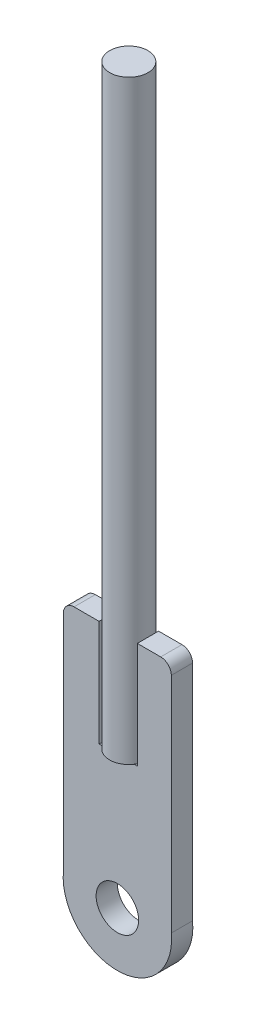
ISO-10303-21;
HEADER;
FILE_DESCRIPTION(('STEP AP214'),'2;1');
FILE_NAME('part.step','',(''),(''),'','','');
FILE_SCHEMA(('AUTOMOTIVE_DESIGN { 1 0 10303 214 1 1 1 1 }'));
ENDSEC;
DATA;
#1=APPLICATION_CONTEXT('core data for automotive mechanical design processes');
#2=APPLICATION_PROTOCOL_DEFINITION('international standard','automotive_design',2000,#1);
#3=PRODUCT_CONTEXT('',#1,'mechanical');
#4=PRODUCT('Part','Part','',(#3));
#5=PRODUCT_RELATED_PRODUCT_CATEGORY('part','',(#4));
#6=PRODUCT_DEFINITION_FORMATION('','',#4);
#7=PRODUCT_DEFINITION_CONTEXT('part definition',#1,'design');
#8=PRODUCT_DEFINITION('design','',#6,#7);
#9=PRODUCT_DEFINITION_SHAPE('','',#8);
#10=(LENGTH_UNIT() NAMED_UNIT(*) SI_UNIT(.MILLI.,.METRE.));
#11=(NAMED_UNIT(*) PLANE_ANGLE_UNIT() SI_UNIT($,.RADIAN.));
#12=(NAMED_UNIT(*) SI_UNIT($,.STERADIAN.) SOLID_ANGLE_UNIT());
#13=UNCERTAINTY_MEASURE_WITH_UNIT(LENGTH_MEASURE(1.E-05),#10,'distance_accuracy_value','');
#14=(GEOMETRIC_REPRESENTATION_CONTEXT(3) GLOBAL_UNCERTAINTY_ASSIGNED_CONTEXT((#13)) GLOBAL_UNIT_ASSIGNED_CONTEXT((#10,
#11,#12)) REPRESENTATION_CONTEXT('',''));
#15=CARTESIAN_POINT('',(0.,0.,0.));
#16=DIRECTION('',(0.,0.,1.));
#17=DIRECTION('',(1.,0.,0.));
#18=AXIS2_PLACEMENT_3D('',#15,#16,#17);
#19=CARTESIAN_POINT('',(-20.7630546142402,45.,5.));
#20=DIRECTION('',(0.,0.,-1.));
#21=DIRECTION('',(-1.,0.,0.));
#22=AXIS2_PLACEMENT_3D('',#19,#20,#21);
#23=PLANE('',#22);
#24=CARTESIAN_POINT('',(-20.7630546142402,45.,5.));
#25=DIRECTION('',(0.,0.,1.));
#26=DIRECTION('',(-1.,0.,0.));
#27=AXIS2_PLACEMENT_3D('',#24,#25,#26);
#28=CIRCLE('',#27,5.);
#29=CARTESIAN_POINT('',(-20.7630546142402,50.,5.));
#30=VERTEX_POINT('',#29);
#31=CARTESIAN_POINT('',(-25.7630546142402,45.,5.));
#32=VERTEX_POINT('',#31);
#33=EDGE_CURVE('E169',#30,#32,#28,.T.);
#34=ORIENTED_EDGE('',*,*,#33,.T.);
#35=DIRECTION('',(0.,-1.,0.));
#36=VECTOR('',#35,1.);
#37=CARTESIAN_POINT('',(-25.7630546142402,45.,5.));
#38=LINE('',#37,#36);
#39=CARTESIAN_POINT('',(-25.7630546142402,-60.,5.));
#40=VERTEX_POINT('',#39);
#41=EDGE_CURVE('E107',#32,#40,#38,.T.);
#42=ORIENTED_EDGE('',*,*,#41,.T.);
#43=CARTESIAN_POINT('',(-0.381527307120084,-62.5,5.));
#44=DIRECTION('',(0.,0.,1.));
#45=DIRECTION('',(-1.,0.,0.));
#46=AXIS2_PLACEMENT_3D('',#43,#44,#45);
#47=CIRCLE('',#46,25.5043511668516);
#48=CARTESIAN_POINT('',(25.,-60.,5.));
#49=VERTEX_POINT('',#48);
#50=EDGE_CURVE('E190',#40,#49,#47,.T.);
#51=ORIENTED_EDGE('',*,*,#50,.T.);
#52=DIRECTION('',(0.,1.,0.));
#53=VECTOR('',#52,1.);
#54=CARTESIAN_POINT('',(25.,45.,5.));
#55=LINE('',#54,#53);
#56=CARTESIAN_POINT('',(25.,45.,5.));
#57=VERTEX_POINT('',#56);
#58=EDGE_CURVE('E209',#49,#57,#55,.T.);
#59=ORIENTED_EDGE('',*,*,#58,.T.);
#60=CARTESIAN_POINT('',(20.,45.,5.));
#61=DIRECTION('',(0.,0.,1.));
#62=DIRECTION('',(1.,0.,0.));
#63=AXIS2_PLACEMENT_3D('',#60,#61,#62);
#64=CIRCLE('',#63,5.);
#65=CARTESIAN_POINT('',(20.,50.,5.));
#66=VERTEX_POINT('',#65);
#67=EDGE_CURVE('E206',#57,#66,#64,.T.);
#68=ORIENTED_EDGE('',*,*,#67,.T.);
#69=DIRECTION('',(-1.,0.,0.));
#70=VECTOR('',#69,1.);
#71=CARTESIAN_POINT('',(20.,50.,5.));
#72=LINE('',#71,#70);
#73=CARTESIAN_POINT('',(9.,50.,5.));
#74=VERTEX_POINT('',#73);
#75=EDGE_CURVE('E208',#66,#74,#72,.T.);
#76=ORIENTED_EDGE('',*,*,#75,.T.);
#77=DIRECTION('',(0.,-1.,0.));
#78=VECTOR('',#77,1.);
#79=CARTESIAN_POINT('',(9.,0.,5.));
#80=LINE('',#79,#78);
#81=CARTESIAN_POINT('',(9.,0.,5.));
#82=VERTEX_POINT('',#81);
#83=EDGE_CURVE('E132',#74,#82,#80,.T.);
#84=ORIENTED_EDGE('',*,*,#83,.T.);
#85=DIRECTION('',(-1.,0.,0.));
#86=VECTOR('',#85,1.);
#87=CARTESIAN_POINT('',(9.,0.,5.));
#88=LINE('',#87,#86);
#89=CARTESIAN_POINT('',(-9.,0.,5.));
#90=VERTEX_POINT('',#89);
#91=EDGE_CURVE('E126',#82,#90,#88,.T.);
#92=ORIENTED_EDGE('',*,*,#91,.T.);
#93=DIRECTION('',(0.,1.,0.));
#94=VECTOR('',#93,1.);
#95=CARTESIAN_POINT('',(-9.,0.,5.));
#96=LINE('',#95,#94);
#97=CARTESIAN_POINT('',(-9.,50.,5.));
#98=VERTEX_POINT('',#97);
#99=EDGE_CURVE('E130',#90,#98,#96,.T.);
#100=ORIENTED_EDGE('',*,*,#99,.T.);
#101=DIRECTION('',(-1.,0.,0.));
#102=VECTOR('',#101,1.);
#103=CARTESIAN_POINT('',(-9.,50.,5.));
#104=LINE('',#103,#102);
#105=EDGE_CURVE('E58',#98,#30,#104,.T.);
#106=ORIENTED_EDGE('',*,*,#105,.T.);
#107=EDGE_LOOP('',(#34,#42,#51,#59,#68,#76,#84,#92,#100,#106));
#108=FACE_BOUND('',#107,.T.);
#109=CARTESIAN_POINT('',(-0.381527307120084,-62.5,5.));
#110=DIRECTION('',(0.,0.,1.));
#111=DIRECTION('',(1.,0.,0.));
#112=AXIS2_PLACEMENT_3D('',#109,#110,#111);
#113=CIRCLE('',#112,10.);
#114=CARTESIAN_POINT('',(9.61847269287992,-62.5,5.));
#115=VERTEX_POINT('',#114);
#116=EDGE_CURVE('E154',#115,#115,#113,.T.);
#117=ORIENTED_EDGE('',*,*,#116,.F.);
#118=EDGE_LOOP('',(#117));
#119=FACE_BOUND('',#118,.T.);
#120=ADVANCED_FACE('F41',(#108,#119),#23,.F.);
#121=CARTESIAN_POINT('',(-20.7630546142402,45.,-5.));
#122=DIRECTION('',(0.,0.,-1.));
#123=DIRECTION('',(-1.,0.,0.));
#124=AXIS2_PLACEMENT_3D('',#121,#122,#123);
#125=PLANE('',#124);
#126=CARTESIAN_POINT('',(-20.7630546142402,45.,-5.));
#127=DIRECTION('',(0.,0.,1.));
#128=DIRECTION('',(-1.,0.,0.));
#129=AXIS2_PLACEMENT_3D('',#126,#127,#128);
#130=CIRCLE('',#129,5.);
#131=CARTESIAN_POINT('',(-20.7630546142402,50.,-5.));
#132=VERTEX_POINT('',#131);
#133=CARTESIAN_POINT('',(-25.7630546142402,45.,-5.));
#134=VERTEX_POINT('',#133);
#135=EDGE_CURVE('E150',#132,#134,#130,.T.);
#136=ORIENTED_EDGE('',*,*,#135,.F.);
#137=DIRECTION('',(-1.,0.,0.));
#138=VECTOR('',#137,1.);
#139=CARTESIAN_POINT('',(-9.,50.,-5.));
#140=LINE('',#139,#138);
#141=CARTESIAN_POINT('',(-9.,50.,-5.));
#142=VERTEX_POINT('',#141);
#143=EDGE_CURVE('E99',#142,#132,#140,.T.);
#144=ORIENTED_EDGE('',*,*,#143,.F.);
#145=DIRECTION('',(0.,1.,0.));
#146=VECTOR('',#145,1.);
#147=CARTESIAN_POINT('',(-9.,0.,-5.));
#148=LINE('',#147,#146);
#149=CARTESIAN_POINT('',(-9.,0.,-5.));
#150=VERTEX_POINT('',#149);
#151=EDGE_CURVE('E93',#150,#142,#148,.T.);
#152=ORIENTED_EDGE('',*,*,#151,.F.);
#153=DIRECTION('',(-1.,0.,0.));
#154=VECTOR('',#153,1.);
#155=CARTESIAN_POINT('',(9.,0.,-5.));
#156=LINE('',#155,#154);
#157=CARTESIAN_POINT('',(9.,0.,-5.));
#158=VERTEX_POINT('',#157);
#159=EDGE_CURVE('E140',#158,#150,#156,.T.);
#160=ORIENTED_EDGE('',*,*,#159,.F.);
#161=DIRECTION('',(0.,-1.,0.));
#162=VECTOR('',#161,1.);
#163=CARTESIAN_POINT('',(9.,0.,-5.));
#164=LINE('',#163,#162);
#165=CARTESIAN_POINT('',(9.,50.,-5.));
#166=VERTEX_POINT('',#165);
#167=EDGE_CURVE('E164',#166,#158,#164,.T.);
#168=ORIENTED_EDGE('',*,*,#167,.F.);
#169=DIRECTION('',(-1.,0.,0.));
#170=VECTOR('',#169,1.);
#171=CARTESIAN_POINT('',(20.,50.,-5.));
#172=LINE('',#171,#170);
#173=CARTESIAN_POINT('',(20.,50.,-5.));
#174=VERTEX_POINT('',#173);
#175=EDGE_CURVE('E162',#174,#166,#172,.T.);
#176=ORIENTED_EDGE('',*,*,#175,.F.);
#177=CARTESIAN_POINT('',(20.,45.,-5.));
#178=DIRECTION('',(0.,0.,1.));
#179=DIRECTION('',(1.,0.,0.));
#180=AXIS2_PLACEMENT_3D('',#177,#178,#179);
#181=CIRCLE('',#180,5.);
#182=CARTESIAN_POINT('',(25.,45.,-5.));
#183=VERTEX_POINT('',#182);
#184=EDGE_CURVE('E160',#183,#174,#181,.T.);
#185=ORIENTED_EDGE('',*,*,#184,.F.);
#186=DIRECTION('',(0.,1.,0.));
#187=VECTOR('',#186,1.);
#188=CARTESIAN_POINT('',(25.,45.,-5.));
#189=LINE('',#188,#187);
#190=CARTESIAN_POINT('',(25.,-60.,-5.));
#191=VERTEX_POINT('',#190);
#192=EDGE_CURVE('E158',#191,#183,#189,.T.);
#193=ORIENTED_EDGE('',*,*,#192,.F.);
#194=CARTESIAN_POINT('',(-0.381527307120084,-62.5,-5.));
#195=DIRECTION('',(0.,0.,1.));
#196=DIRECTION('',(-1.,0.,0.));
#197=AXIS2_PLACEMENT_3D('',#194,#195,#196);
#198=CIRCLE('',#197,25.5043511668516);
#199=CARTESIAN_POINT('',(-25.7630546142402,-60.,-5.));
#200=VERTEX_POINT('',#199);
#201=EDGE_CURVE('E156',#200,#191,#198,.T.);
#202=ORIENTED_EDGE('',*,*,#201,.F.);
#203=DIRECTION('',(0.,-1.,0.));
#204=VECTOR('',#203,1.);
#205=CARTESIAN_POINT('',(-25.7630546142402,45.,-5.));
#206=LINE('',#205,#204);
#207=EDGE_CURVE('E153',#134,#200,#206,.T.);
#208=ORIENTED_EDGE('',*,*,#207,.F.);
#209=EDGE_LOOP('',(#136,#144,#152,#160,#168,#176,#185,#193,#202,#208));
#210=FACE_BOUND('',#209,.T.);
#211=CARTESIAN_POINT('',(-0.381527307120084,-62.5,-5.));
#212=DIRECTION('',(0.,0.,1.));
#213=DIRECTION('',(1.,0.,0.));
#214=AXIS2_PLACEMENT_3D('',#211,#212,#213);
#215=CIRCLE('',#214,10.);
#216=CARTESIAN_POINT('',(9.61847269287992,-62.5,-5.));
#217=VERTEX_POINT('',#216);
#218=EDGE_CURVE('E217',#217,#217,#215,.T.);
#219=ORIENTED_EDGE('',*,*,#218,.T.);
#220=EDGE_LOOP('',(#219));
#221=FACE_BOUND('',#220,.T.);
#222=ADVANCED_FACE('F194',(#210,#221),#125,.T.);
#223=CARTESIAN_POINT('',(-20.7630546142402,45.,5.));
#224=DIRECTION('',(0.,0.,-1.));
#225=DIRECTION('',(-1.,0.,0.));
#226=AXIS2_PLACEMENT_3D('',#223,#224,#225);
#227=CYLINDRICAL_SURFACE('',#226,5.);
#228=ORIENTED_EDGE('',*,*,#135,.T.);
#229=DIRECTION('',(0.,0.,-1.));
#230=VECTOR('',#229,1.);
#231=CARTESIAN_POINT('',(-25.7630546142402,45.,5.));
#232=LINE('',#231,#230);
#233=EDGE_CURVE('E12',#32,#134,#232,.T.);
#234=ORIENTED_EDGE('',*,*,#233,.F.);
#235=ORIENTED_EDGE('',*,*,#33,.F.);
#236=DIRECTION('',(0.,0.,-1.));
#237=VECTOR('',#236,1.);
#238=CARTESIAN_POINT('',(-20.7630546142402,50.,5.));
#239=LINE('',#238,#237);
#240=EDGE_CURVE('E146',#30,#132,#239,.T.);
#241=ORIENTED_EDGE('',*,*,#240,.T.);
#242=EDGE_LOOP('',(#228,#234,#235,#241));
#243=FACE_BOUND('',#242,.T.);
#244=ADVANCED_FACE('F43',(#243),#227,.T.);
#245=CARTESIAN_POINT('',(-25.7630546142402,45.,5.));
#246=DIRECTION('',(1.,0.,0.));
#247=DIRECTION('',(0.,1.,0.));
#248=AXIS2_PLACEMENT_3D('',#245,#246,#247);
#249=PLANE('',#248);
#250=ORIENTED_EDGE('',*,*,#207,.T.);
#251=DIRECTION('',(0.,0.,-1.));
#252=VECTOR('',#251,1.);
#253=CARTESIAN_POINT('',(-25.7630546142402,-60.,5.));
#254=LINE('',#253,#252);
#255=EDGE_CURVE('E50',#40,#200,#254,.T.);
#256=ORIENTED_EDGE('',*,*,#255,.F.);
#257=ORIENTED_EDGE('',*,*,#41,.F.);
#258=ORIENTED_EDGE('',*,*,#233,.T.);
#259=EDGE_LOOP('',(#250,#256,#257,#258));
#260=FACE_BOUND('',#259,.T.);
#261=ADVANCED_FACE('F253',(#260),#249,.F.);
#262=CARTESIAN_POINT('',(-0.381527307120084,-62.5,5.));
#263=DIRECTION('',(0.,0.,-1.));
#264=DIRECTION('',(-1.,0.,0.));
#265=AXIS2_PLACEMENT_3D('',#262,#263,#264);
#266=CYLINDRICAL_SURFACE('',#265,25.5043511668516);
#267=ORIENTED_EDGE('',*,*,#201,.T.);
#268=DIRECTION('',(0.,0.,-1.));
#269=VECTOR('',#268,1.);
#270=CARTESIAN_POINT('',(25.,-60.,5.));
#271=LINE('',#270,#269);
#272=EDGE_CURVE('E182',#49,#191,#271,.T.);
#273=ORIENTED_EDGE('',*,*,#272,.F.);
#274=ORIENTED_EDGE('',*,*,#50,.F.);
#275=ORIENTED_EDGE('',*,*,#255,.T.);
#276=EDGE_LOOP('',(#267,#273,#274,#275));
#277=FACE_BOUND('',#276,.T.);
#278=ADVANCED_FACE('F188',(#277),#266,.T.);
#279=CARTESIAN_POINT('',(25.,45.,5.));
#280=DIRECTION('',(-1.,0.,0.));
#281=DIRECTION('',(0.,-1.,0.));
#282=AXIS2_PLACEMENT_3D('',#279,#280,#281);
#283=PLANE('',#282);
#284=ORIENTED_EDGE('',*,*,#192,.T.);
#285=DIRECTION('',(0.,0.,-1.));
#286=VECTOR('',#285,1.);
#287=CARTESIAN_POINT('',(25.,45.,5.));
#288=LINE('',#287,#286);
#289=EDGE_CURVE('E179',#57,#183,#288,.T.);
#290=ORIENTED_EDGE('',*,*,#289,.F.);
#291=ORIENTED_EDGE('',*,*,#58,.F.);
#292=ORIENTED_EDGE('',*,*,#272,.T.);
#293=EDGE_LOOP('',(#284,#290,#291,#292));
#294=FACE_BOUND('',#293,.T.);
#295=ADVANCED_FACE('F200',(#294),#283,.F.);
#296=CARTESIAN_POINT('',(20.,45.,5.));
#297=DIRECTION('',(0.,0.,-1.));
#298=DIRECTION('',(-1.,0.,0.));
#299=AXIS2_PLACEMENT_3D('',#296,#297,#298);
#300=CYLINDRICAL_SURFACE('',#299,5.);
#301=ORIENTED_EDGE('',*,*,#184,.T.);
#302=DIRECTION('',(0.,0.,-1.));
#303=VECTOR('',#302,1.);
#304=CARTESIAN_POINT('',(20.,50.,5.));
#305=LINE('',#304,#303);
#306=EDGE_CURVE('E176',#66,#174,#305,.T.);
#307=ORIENTED_EDGE('',*,*,#306,.F.);
#308=ORIENTED_EDGE('',*,*,#67,.F.);
#309=ORIENTED_EDGE('',*,*,#289,.T.);
#310=EDGE_LOOP('',(#301,#307,#308,#309));
#311=FACE_BOUND('',#310,.T.);
#312=ADVANCED_FACE('F204',(#311),#300,.T.);
#313=CARTESIAN_POINT('',(20.,50.,5.));
#314=DIRECTION('',(0.,-1.,0.));
#315=DIRECTION('',(0.,0.,-1.));
#316=AXIS2_PLACEMENT_3D('',#313,#314,#315);
#317=PLANE('',#316);
#318=ORIENTED_EDGE('',*,*,#175,.T.);
#319=DIRECTION('',(0.,0.,-1.));
#320=VECTOR('',#319,1.);
#321=CARTESIAN_POINT('',(9.,50.,5.));
#322=LINE('',#321,#320);
#323=EDGE_CURVE('E173',#74,#166,#322,.T.);
#324=ORIENTED_EDGE('',*,*,#323,.F.);
#325=ORIENTED_EDGE('',*,*,#75,.F.);
#326=ORIENTED_EDGE('',*,*,#306,.T.);
#327=EDGE_LOOP('',(#318,#324,#325,#326));
#328=FACE_BOUND('',#327,.T.);
#329=ADVANCED_FACE('F243',(#328),#317,.F.);
#330=CARTESIAN_POINT('',(9.,0.,5.));
#331=DIRECTION('',(1.,0.,0.));
#332=DIRECTION('',(0.,0.,-1.));
#333=AXIS2_PLACEMENT_3D('',#330,#331,#332);
#334=PLANE('',#333);
#335=ORIENTED_EDGE('',*,*,#167,.T.);
#336=DIRECTION('',(0.,0.,-1.));
#337=VECTOR('',#336,1.);
#338=CARTESIAN_POINT('',(9.,0.,5.));
#339=LINE('',#338,#337);
#340=EDGE_CURVE('E141',#82,#158,#339,.T.);
#341=ORIENTED_EDGE('',*,*,#340,.F.);
#342=ORIENTED_EDGE('',*,*,#83,.F.);
#343=ORIENTED_EDGE('',*,*,#323,.T.);
#344=EDGE_LOOP('',(#335,#341,#342,#343));
#345=FACE_BOUND('',#344,.T.);
#346=ADVANCED_FACE('F240',(#345),#334,.F.);
#347=CARTESIAN_POINT('',(9.,0.,5.));
#348=DIRECTION('',(0.,-1.,0.));
#349=DIRECTION('',(0.,0.,-1.));
#350=AXIS2_PLACEMENT_3D('',#347,#348,#349);
#351=PLANE('',#350);
#352=ORIENTED_EDGE('',*,*,#159,.T.);
#353=DIRECTION('',(0.,0.,-1.));
#354=VECTOR('',#353,1.);
#355=CARTESIAN_POINT('',(-9.,0.,5.));
#356=LINE('',#355,#354);
#357=EDGE_CURVE('E137',#90,#150,#356,.T.);
#358=ORIENTED_EDGE('',*,*,#357,.F.);
#359=ORIENTED_EDGE('',*,*,#91,.F.);
#360=ORIENTED_EDGE('',*,*,#340,.T.);
#361=EDGE_LOOP('',(#352,#358,#359,#360));
#362=FACE_BOUND('',#361,.T.);
#363=ADVANCED_FACE('F138',(#362),#351,.F.);
#364=CARTESIAN_POINT('',(-9.,0.,5.));
#365=DIRECTION('',(-1.,0.,0.));
#366=DIRECTION('',(0.,-1.,0.));
#367=AXIS2_PLACEMENT_3D('',#364,#365,#366);
#368=PLANE('',#367);
#369=ORIENTED_EDGE('',*,*,#151,.T.);
#370=DIRECTION('',(0.,0.,-1.));
#371=VECTOR('',#370,1.);
#372=CARTESIAN_POINT('',(-9.,50.,5.));
#373=LINE('',#372,#371);
#374=EDGE_CURVE('E142',#98,#142,#373,.T.);
#375=ORIENTED_EDGE('',*,*,#374,.F.);
#376=ORIENTED_EDGE('',*,*,#99,.F.);
#377=ORIENTED_EDGE('',*,*,#357,.T.);
#378=EDGE_LOOP('',(#369,#375,#376,#377));
#379=FACE_BOUND('',#378,.T.);
#380=ADVANCED_FACE('F144',(#379),#368,.F.);
#381=CARTESIAN_POINT('',(-9.,50.,5.));
#382=DIRECTION('',(0.,-1.,0.));
#383=DIRECTION('',(0.,0.,-1.));
#384=AXIS2_PLACEMENT_3D('',#381,#382,#383);
#385=PLANE('',#384);
#386=ORIENTED_EDGE('',*,*,#143,.T.);
#387=ORIENTED_EDGE('',*,*,#240,.F.);
#388=ORIENTED_EDGE('',*,*,#105,.F.);
#389=ORIENTED_EDGE('',*,*,#374,.T.);
#390=EDGE_LOOP('',(#386,#387,#388,#389));
#391=FACE_BOUND('',#390,.T.);
#392=ADVANCED_FACE('F233',(#391),#385,.F.);
#393=CARTESIAN_POINT('',(-0.381527307120084,-62.5,5.));
#394=DIRECTION('',(0.,0.,-1.));
#395=DIRECTION('',(-1.,0.,0.));
#396=AXIS2_PLACEMENT_3D('',#393,#394,#395);
#397=CYLINDRICAL_SURFACE('',#396,10.);
#398=ORIENTED_EDGE('',*,*,#116,.T.);
#399=EDGE_LOOP('',(#398));
#400=FACE_BOUND('',#399,.T.);
#401=ORIENTED_EDGE('',*,*,#218,.F.);
#402=EDGE_LOOP('',(#401));
#403=FACE_BOUND('',#402,.T.);
#404=ADVANCED_FACE('F223',(#400,#403),#397,.F.);
#405=CLOSED_SHELL('',(#120,#222,#244,#261,#278,#295,#312,#329,#346,#363,#380,#392,#404));
#406=MANIFOLD_SOLID_BREP('B2',#405);
#407=CARTESIAN_POINT('',(0.,280.,0.));
#408=DIRECTION('',(0.,-1.,0.));
#409=DIRECTION('',(0.,0.,-1.));
#410=AXIS2_PLACEMENT_3D('',#407,#408,#409);
#411=CYLINDRICAL_SURFACE('',#410,9.);
#412=CARTESIAN_POINT('',(0.,280.,0.));
#413=DIRECTION('',(0.,1.,0.));
#414=DIRECTION('',(0.,0.,1.));
#415=AXIS2_PLACEMENT_3D('',#412,#413,#414);
#416=CIRCLE('',#415,9.);
#417=CARTESIAN_POINT('',(0.,280.,9.));
#418=VERTEX_POINT('',#417);
#419=EDGE_CURVE('E40',#418,#418,#416,.T.);
#420=ORIENTED_EDGE('',*,*,#419,.F.);
#421=EDGE_LOOP('',(#420));
#422=FACE_BOUND('',#421,.T.);
#423=CARTESIAN_POINT('',(0.,0.,0.));
#424=DIRECTION('',(0.,1.,0.));
#425=DIRECTION('',(0.,0.,1.));
#426=AXIS2_PLACEMENT_3D('',#423,#424,#425);
#427=CIRCLE('',#426,9.);
#428=CARTESIAN_POINT('',(0.,0.,9.));
#429=VERTEX_POINT('',#428);
#430=EDGE_CURVE('E345',#429,#429,#427,.T.);
#431=ORIENTED_EDGE('',*,*,#430,.T.);
#432=EDGE_LOOP('',(#431));
#433=FACE_BOUND('',#432,.T.);
#434=ADVANCED_FACE('F342',(#422,#433),#411,.T.);
#435=CARTESIAN_POINT('',(0.,280.,0.));
#436=DIRECTION('',(0.,1.,0.));
#437=DIRECTION('',(0.,0.,1.));
#438=AXIS2_PLACEMENT_3D('',#435,#436,#437);
#439=PLANE('',#438);
#440=ORIENTED_EDGE('',*,*,#419,.T.);
#441=EDGE_LOOP('',(#440));
#442=FACE_BOUND('',#441,.T.);
#443=ADVANCED_FACE('F357',(#442),#439,.T.);
#444=CARTESIAN_POINT('',(0.,0.,0.));
#445=DIRECTION('',(0.,1.,0.));
#446=DIRECTION('',(0.,0.,1.));
#447=AXIS2_PLACEMENT_3D('',#444,#445,#446);
#448=PLANE('',#447);
#449=ORIENTED_EDGE('',*,*,#430,.F.);
#450=EDGE_LOOP('',(#449));
#451=FACE_BOUND('',#450,.T.);
#452=ADVANCED_FACE('F355',(#451),#448,.F.);
#453=CLOSED_SHELL('',(#434,#443,#452));
#454=MANIFOLD_SOLID_BREP('B6',#453);
#455=ADVANCED_BREP_SHAPE_REPRESENTATION('',(#18,#406,#454),#14);
#456=SHAPE_DEFINITION_REPRESENTATION(#9,#455);
ENDSEC;
END-ISO-10303-21;
